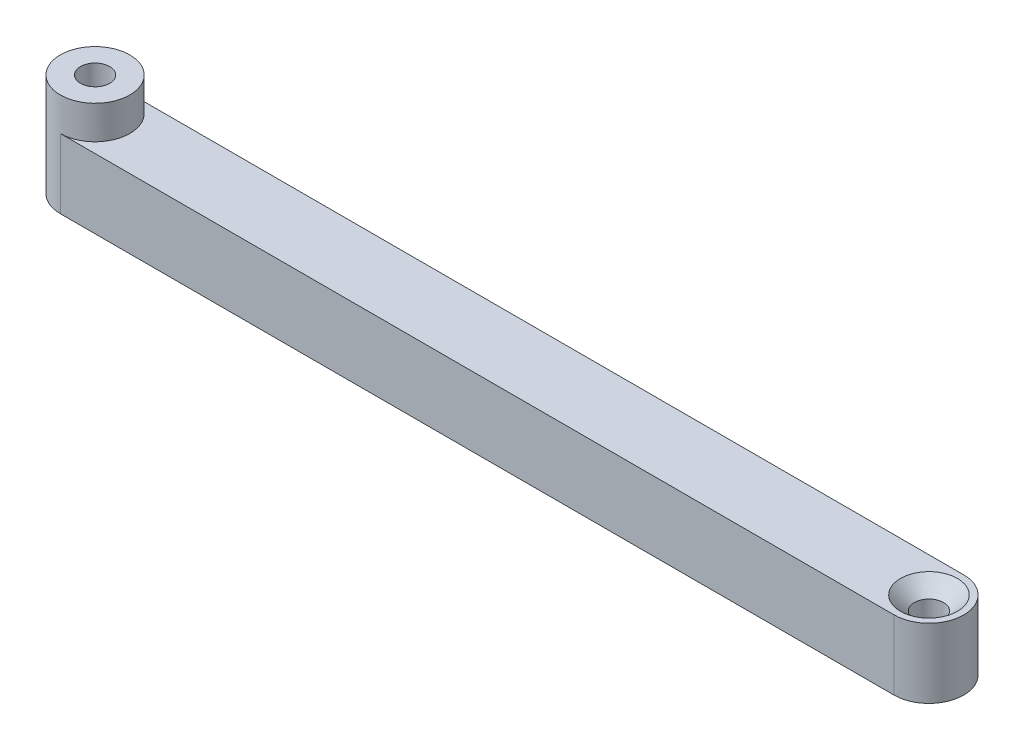
ISO-10303-21;
HEADER;
FILE_DESCRIPTION(('STEP AP214'),'2;1');
FILE_NAME('part.step','',(''),(''),'','','');
FILE_SCHEMA(('AUTOMOTIVE_DESIGN { 1 0 10303 214 1 1 1 1 }'));
ENDSEC;
DATA;
#1=APPLICATION_CONTEXT('core data for automotive mechanical design processes');
#2=APPLICATION_PROTOCOL_DEFINITION('international standard','automotive_design',2000,#1);
#3=PRODUCT_CONTEXT('',#1,'mechanical');
#4=PRODUCT('Part','Part','',(#3));
#5=PRODUCT_RELATED_PRODUCT_CATEGORY('part','',(#4));
#6=PRODUCT_DEFINITION_FORMATION('','',#4);
#7=PRODUCT_DEFINITION_CONTEXT('part definition',#1,'design');
#8=PRODUCT_DEFINITION('design','',#6,#7);
#9=PRODUCT_DEFINITION_SHAPE('','',#8);
#10=(LENGTH_UNIT() NAMED_UNIT(*) SI_UNIT(.MILLI.,.METRE.));
#11=(NAMED_UNIT(*) PLANE_ANGLE_UNIT() SI_UNIT($,.RADIAN.));
#12=(NAMED_UNIT(*) SI_UNIT($,.STERADIAN.) SOLID_ANGLE_UNIT());
#13=UNCERTAINTY_MEASURE_WITH_UNIT(LENGTH_MEASURE(1.E-05),#10,'distance_accuracy_value','');
#14=(GEOMETRIC_REPRESENTATION_CONTEXT(3) GLOBAL_UNCERTAINTY_ASSIGNED_CONTEXT((#13)) GLOBAL_UNIT_ASSIGNED_CONTEXT((#10,
#11,#12)) REPRESENTATION_CONTEXT('',''));
#15=CARTESIAN_POINT('',(0.,0.,0.));
#16=DIRECTION('',(0.,0.,1.));
#17=DIRECTION('',(1.,0.,0.));
#18=AXIS2_PLACEMENT_3D('',#15,#16,#17);
#19=CARTESIAN_POINT('',(0.,5.,0.));
#20=DIRECTION('',(0.,1.,0.));
#21=DIRECTION('',(0.,0.,1.));
#22=AXIS2_PLACEMENT_3D('',#19,#20,#21);
#23=PLANE('',#22);
#24=CARTESIAN_POINT('',(0.,5.,0.));
#25=DIRECTION('',(0.,1.,0.));
#26=DIRECTION('',(0.,0.,1.));
#27=AXIS2_PLACEMENT_3D('',#24,#25,#26);
#28=CIRCLE('',#27,2.5);
#29=CARTESIAN_POINT('',(0.,5.,2.5));
#30=VERTEX_POINT('',#29);
#31=CARTESIAN_POINT('',(0.,5.,-2.5));
#32=VERTEX_POINT('',#31);
#33=EDGE_CURVE('E102',#30,#32,#28,.T.);
#34=ORIENTED_EDGE('',*,*,#33,.F.);
#35=DIRECTION('',(1.,0.,0.));
#36=VECTOR('',#35,1.);
#37=CARTESIAN_POINT('',(0.,5.,2.5));
#38=LINE('',#37,#36);
#39=CARTESIAN_POINT('',(60.,5.,2.5));
#40=VERTEX_POINT('',#39);
#41=EDGE_CURVE('E91',#30,#40,#38,.T.);
#42=ORIENTED_EDGE('',*,*,#41,.T.);
#43=CARTESIAN_POINT('',(60.,5.,0.));
#44=DIRECTION('',(0.,1.,0.));
#45=DIRECTION('',(0.,0.,1.));
#46=AXIS2_PLACEMENT_3D('',#43,#44,#45);
#47=CIRCLE('',#46,2.5);
#48=CARTESIAN_POINT('',(60.,5.,-2.5));
#49=VERTEX_POINT('',#48);
#50=EDGE_CURVE('E113',#40,#49,#47,.T.);
#51=ORIENTED_EDGE('',*,*,#50,.T.);
#52=DIRECTION('',(-1.,0.,0.));
#53=VECTOR('',#52,1.);
#54=CARTESIAN_POINT('',(0.,5.,-2.5));
#55=LINE('',#54,#53);
#56=EDGE_CURVE('E64',#49,#32,#55,.T.);
#57=ORIENTED_EDGE('',*,*,#56,.T.);
#58=EDGE_LOOP('',(#34,#42,#51,#57));
#59=FACE_BOUND('',#58,.T.);
#60=CARTESIAN_POINT('',(60.,5.,0.));
#61=DIRECTION('',(0.,1.,0.));
#62=DIRECTION('',(0.,0.,1.));
#63=AXIS2_PLACEMENT_3D('',#60,#61,#62);
#64=CIRCLE('',#63,2.05000000000001);
#65=CARTESIAN_POINT('',(60.,5.,2.05000000000001));
#66=VERTEX_POINT('',#65);
#67=EDGE_CURVE('E155',#66,#66,#64,.F.);
#68=ORIENTED_EDGE('',*,*,#67,.T.);
#69=EDGE_LOOP('',(#68));
#70=FACE_BOUND('',#69,.T.);
#71=ADVANCED_FACE('F45',(#59,#70),#23,.T.);
#72=CARTESIAN_POINT('',(0.,0.,0.));
#73=DIRECTION('',(0.,1.,0.));
#74=DIRECTION('',(0.,0.,1.));
#75=AXIS2_PLACEMENT_3D('',#72,#73,#74);
#76=PLANE('',#75);
#77=CARTESIAN_POINT('',(0.,0.,0.));
#78=DIRECTION('',(0.,1.,0.));
#79=DIRECTION('',(0.,0.,1.));
#80=AXIS2_PLACEMENT_3D('',#77,#78,#79);
#81=CIRCLE('',#80,2.05);
#82=CARTESIAN_POINT('',(0.,0.,2.05));
#83=VERTEX_POINT('',#82);
#84=EDGE_CURVE('E56',#83,#83,#81,.T.);
#85=ORIENTED_EDGE('',*,*,#84,.T.);
#86=EDGE_LOOP('',(#85));
#87=FACE_BOUND('',#86,.T.);
#88=CARTESIAN_POINT('',(0.,0.,0.));
#89=DIRECTION('',(0.,1.,0.));
#90=DIRECTION('',(0.,0.,1.));
#91=AXIS2_PLACEMENT_3D('',#88,#89,#90);
#92=CIRCLE('',#91,2.5);
#93=CARTESIAN_POINT('',(0.,0.,-2.5));
#94=VERTEX_POINT('',#93);
#95=CARTESIAN_POINT('',(0.,0.,2.5));
#96=VERTEX_POINT('',#95);
#97=EDGE_CURVE('E104',#94,#96,#92,.T.);
#98=ORIENTED_EDGE('',*,*,#97,.F.);
#99=DIRECTION('',(-1.,0.,0.));
#100=VECTOR('',#99,1.);
#101=CARTESIAN_POINT('',(0.,0.,-2.5));
#102=LINE('',#101,#100);
#103=CARTESIAN_POINT('',(60.,0.,-2.5));
#104=VERTEX_POINT('',#103);
#105=EDGE_CURVE('E87',#104,#94,#102,.T.);
#106=ORIENTED_EDGE('',*,*,#105,.F.);
#107=CARTESIAN_POINT('',(60.,0.,0.));
#108=DIRECTION('',(0.,1.,0.));
#109=DIRECTION('',(0.,0.,1.));
#110=AXIS2_PLACEMENT_3D('',#107,#108,#109);
#111=CIRCLE('',#110,2.5);
#112=CARTESIAN_POINT('',(60.,0.,2.5));
#113=VERTEX_POINT('',#112);
#114=EDGE_CURVE('E82',#113,#104,#111,.T.);
#115=ORIENTED_EDGE('',*,*,#114,.F.);
#116=DIRECTION('',(1.,0.,0.));
#117=VECTOR('',#116,1.);
#118=CARTESIAN_POINT('',(0.,0.,2.5));
#119=LINE('',#118,#117);
#120=EDGE_CURVE('E138',#96,#113,#119,.T.);
#121=ORIENTED_EDGE('',*,*,#120,.F.);
#122=EDGE_LOOP('',(#98,#106,#115,#121));
#123=FACE_BOUND('',#122,.T.);
#124=CARTESIAN_POINT('',(60.,0.,0.));
#125=DIRECTION('',(0.,1.,0.));
#126=DIRECTION('',(0.,0.,1.));
#127=AXIS2_PLACEMENT_3D('',#124,#125,#126);
#128=CIRCLE('',#127,1.05);
#129=CARTESIAN_POINT('',(60.,0.,1.05));
#130=VERTEX_POINT('',#129);
#131=EDGE_CURVE('E123',#130,#130,#128,.T.);
#132=ORIENTED_EDGE('',*,*,#131,.T.);
#133=EDGE_LOOP('',(#132));
#134=FACE_BOUND('',#133,.T.);
#135=ADVANCED_FACE('F162',(#87,#123,#134),#76,.F.);
#136=CARTESIAN_POINT('',(0.,5.,0.));
#137=DIRECTION('',(0.,-1.,0.));
#138=DIRECTION('',(0.,0.,-1.));
#139=AXIS2_PLACEMENT_3D('',#136,#137,#138);
#140=CYLINDRICAL_SURFACE('',#139,2.5);
#141=ORIENTED_EDGE('',*,*,#97,.T.);
#142=DIRECTION('',(0.,-1.,0.));
#143=VECTOR('',#142,1.);
#144=CARTESIAN_POINT('',(0.,5.,2.5));
#145=LINE('',#144,#143);
#146=EDGE_CURVE('E99',#30,#96,#145,.T.);
#147=ORIENTED_EDGE('',*,*,#146,.F.);
#148=ORIENTED_EDGE('',*,*,#33,.T.);
#149=DIRECTION('',(0.,-1.,0.));
#150=VECTOR('',#149,1.);
#151=CARTESIAN_POINT('',(0.,5.,-2.5));
#152=LINE('',#151,#150);
#153=EDGE_CURVE('E135',#32,#94,#152,.T.);
#154=ORIENTED_EDGE('',*,*,#153,.T.);
#155=EDGE_LOOP('',(#141,#147,#148,#154));
#156=FACE_BOUND('',#155,.T.);
#157=CARTESIAN_POINT('',(0.,7.4,0.));
#158=DIRECTION('',(0.,1.,0.));
#159=DIRECTION('',(0.,0.,1.));
#160=AXIS2_PLACEMENT_3D('',#157,#158,#159);
#161=CIRCLE('',#160,2.5);
#162=CARTESIAN_POINT('',(0.,7.4,2.5));
#163=VERTEX_POINT('',#162);
#164=EDGE_CURVE('E117',#163,#163,#161,.T.);
#165=ORIENTED_EDGE('',*,*,#164,.F.);
#166=EDGE_LOOP('',(#165));
#167=FACE_BOUND('',#166,.T.);
#168=ADVANCED_FACE('F100',(#156,#167),#140,.T.);
#169=CARTESIAN_POINT('',(0.,5.,2.5));
#170=DIRECTION('',(0.,0.,-1.));
#171=DIRECTION('',(-1.,0.,0.));
#172=AXIS2_PLACEMENT_3D('',#169,#170,#171);
#173=PLANE('',#172);
#174=ORIENTED_EDGE('',*,*,#120,.T.);
#175=DIRECTION('',(0.,-1.,0.));
#176=VECTOR('',#175,1.);
#177=CARTESIAN_POINT('',(60.,5.,2.5));
#178=LINE('',#177,#176);
#179=EDGE_CURVE('E108',#40,#113,#178,.T.);
#180=ORIENTED_EDGE('',*,*,#179,.F.);
#181=ORIENTED_EDGE('',*,*,#41,.F.);
#182=ORIENTED_EDGE('',*,*,#146,.T.);
#183=EDGE_LOOP('',(#174,#180,#181,#182));
#184=FACE_BOUND('',#183,.T.);
#185=ADVANCED_FACE('F110',(#184),#173,.F.);
#186=CARTESIAN_POINT('',(60.,5.,0.));
#187=DIRECTION('',(0.,-1.,0.));
#188=DIRECTION('',(0.,0.,-1.));
#189=AXIS2_PLACEMENT_3D('',#186,#187,#188);
#190=CYLINDRICAL_SURFACE('',#189,2.5);
#191=ORIENTED_EDGE('',*,*,#114,.T.);
#192=DIRECTION('',(0.,-1.,0.));
#193=VECTOR('',#192,1.);
#194=CARTESIAN_POINT('',(60.,5.,-2.5));
#195=LINE('',#194,#193);
#196=EDGE_CURVE('E147',#49,#104,#195,.T.);
#197=ORIENTED_EDGE('',*,*,#196,.F.);
#198=ORIENTED_EDGE('',*,*,#50,.F.);
#199=ORIENTED_EDGE('',*,*,#179,.T.);
#200=EDGE_LOOP('',(#191,#197,#198,#199));
#201=FACE_BOUND('',#200,.T.);
#202=ADVANCED_FACE('F191',(#201),#190,.T.);
#203=CARTESIAN_POINT('',(0.,5.,-2.5));
#204=DIRECTION('',(0.,0.,1.));
#205=DIRECTION('',(1.,0.,0.));
#206=AXIS2_PLACEMENT_3D('',#203,#204,#205);
#207=PLANE('',#206);
#208=ORIENTED_EDGE('',*,*,#105,.T.);
#209=ORIENTED_EDGE('',*,*,#153,.F.);
#210=ORIENTED_EDGE('',*,*,#56,.F.);
#211=ORIENTED_EDGE('',*,*,#196,.T.);
#212=EDGE_LOOP('',(#208,#209,#210,#211));
#213=FACE_BOUND('',#212,.T.);
#214=ADVANCED_FACE('F188',(#213),#207,.F.);
#215=CARTESIAN_POINT('',(0.,5.,0.));
#216=DIRECTION('',(0.,-1.,0.));
#217=DIRECTION('',(0.,0.,-1.));
#218=AXIS2_PLACEMENT_3D('',#215,#216,#217);
#219=CYLINDRICAL_SURFACE('',#218,1.05);
#220=CARTESIAN_POINT('',(0.,1.00000000000001,0.));
#221=DIRECTION('',(0.,1.,0.));
#222=DIRECTION('',(0.,0.,1.));
#223=AXIS2_PLACEMENT_3D('',#220,#221,#222);
#224=CIRCLE('',#223,1.05);
#225=CARTESIAN_POINT('',(0.,1.00000000000001,1.05));
#226=VERTEX_POINT('',#225);
#227=EDGE_CURVE('E11',#226,#226,#224,.F.);
#228=ORIENTED_EDGE('',*,*,#227,.T.);
#229=EDGE_LOOP('',(#228));
#230=FACE_BOUND('',#229,.T.);
#231=CARTESIAN_POINT('',(0.,7.4,0.));
#232=DIRECTION('',(0.,1.,0.));
#233=DIRECTION('',(0.,0.,1.));
#234=AXIS2_PLACEMENT_3D('',#231,#232,#233);
#235=CIRCLE('',#234,1.05);
#236=CARTESIAN_POINT('',(0.,7.4,1.05));
#237=VERTEX_POINT('',#236);
#238=EDGE_CURVE('E118',#237,#237,#235,.T.);
#239=ORIENTED_EDGE('',*,*,#238,.T.);
#240=EDGE_LOOP('',(#239));
#241=FACE_BOUND('',#240,.T.);
#242=ADVANCED_FACE('F185',(#230,#241),#219,.F.);
#243=CARTESIAN_POINT('',(60.,5.,0.));
#244=DIRECTION('',(0.,-1.,0.));
#245=DIRECTION('',(0.,0.,-1.));
#246=AXIS2_PLACEMENT_3D('',#243,#244,#245);
#247=CYLINDRICAL_SURFACE('',#246,1.05);
#248=CARTESIAN_POINT('',(60.,4.,0.));
#249=DIRECTION('',(0.,1.,0.));
#250=DIRECTION('',(0.,0.,1.));
#251=AXIS2_PLACEMENT_3D('',#248,#249,#250);
#252=CIRCLE('',#251,1.05);
#253=CARTESIAN_POINT('',(60.,4.,1.05));
#254=VERTEX_POINT('',#253);
#255=EDGE_CURVE('E107',#254,#254,#252,.T.);
#256=ORIENTED_EDGE('',*,*,#255,.T.);
#257=EDGE_LOOP('',(#256));
#258=FACE_BOUND('',#257,.T.);
#259=ORIENTED_EDGE('',*,*,#131,.F.);
#260=EDGE_LOOP('',(#259));
#261=FACE_BOUND('',#260,.T.);
#262=ADVANCED_FACE('F175',(#258,#261),#247,.F.);
#263=CARTESIAN_POINT('',(60.,4.,0.));
#264=DIRECTION('',(0.,1.,0.));
#265=DIRECTION('',(0.,0.,1.));
#266=AXIS2_PLACEMENT_3D('',#263,#264,#265);
#267=CONICAL_SURFACE('',#266,1.05,0.78539816339745);
#268=ORIENTED_EDGE('',*,*,#67,.F.);
#269=EDGE_LOOP('',(#268));
#270=FACE_BOUND('',#269,.T.);
#271=ORIENTED_EDGE('',*,*,#255,.F.);
#272=EDGE_LOOP('',(#271));
#273=FACE_BOUND('',#272,.T.);
#274=ADVANCED_FACE('F167',(#270,#273),#267,.F.);
#275=CARTESIAN_POINT('',(0.,0.,0.));
#276=DIRECTION('',(0.,-1.,0.));
#277=DIRECTION('',(0.,0.,-1.));
#278=AXIS2_PLACEMENT_3D('',#275,#276,#277);
#279=CONICAL_SURFACE('',#278,2.05,0.785398163397447);
#280=ORIENTED_EDGE('',*,*,#227,.F.);
#281=EDGE_LOOP('',(#280));
#282=FACE_BOUND('',#281,.T.);
#283=ORIENTED_EDGE('',*,*,#84,.F.);
#284=EDGE_LOOP('',(#283));
#285=FACE_BOUND('',#284,.T.);
#286=ADVANCED_FACE('F48',(#282,#285),#279,.F.);
#287=CARTESIAN_POINT('',(0.,7.4,0.));
#288=DIRECTION('',(0.,1.,0.));
#289=DIRECTION('',(0.,0.,1.));
#290=AXIS2_PLACEMENT_3D('',#287,#288,#289);
#291=PLANE('',#290);
#292=ORIENTED_EDGE('',*,*,#164,.T.);
#293=EDGE_LOOP('',(#292));
#294=FACE_BOUND('',#293,.T.);
#295=ORIENTED_EDGE('',*,*,#238,.F.);
#296=EDGE_LOOP('',(#295));
#297=FACE_BOUND('',#296,.T.);
#298=ADVANCED_FACE('F166',(#294,#297),#291,.T.);
#299=CLOSED_SHELL('',(#71,#135,#168,#185,#202,#214,#242,#262,#274,#286,#298));
#300=MANIFOLD_SOLID_BREP('B2',#299);
#301=ADVANCED_BREP_SHAPE_REPRESENTATION('',(#18,#300),#14);
#302=SHAPE_DEFINITION_REPRESENTATION(#9,#301);
ENDSEC;
END-ISO-10303-21;
